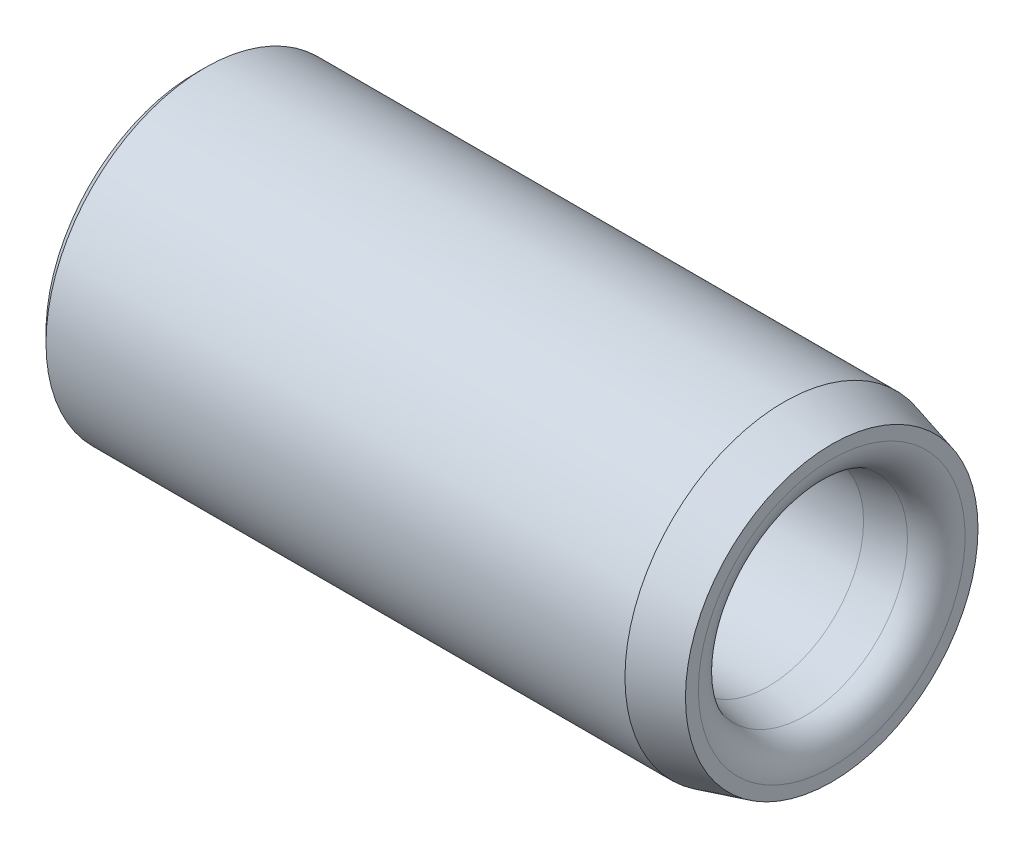
ISO-10303-21;
HEADER;
FILE_DESCRIPTION(('STEP AP214'),'2;1');
FILE_NAME('part.step','',(''),(''),'','','');
FILE_SCHEMA(('AUTOMOTIVE_DESIGN { 1 0 10303 214 1 1 1 1 }'));
ENDSEC;
DATA;
#1=APPLICATION_CONTEXT('core data for automotive mechanical design processes');
#2=APPLICATION_PROTOCOL_DEFINITION('international standard','automotive_design',2000,#1);
#3=PRODUCT_CONTEXT('',#1,'mechanical');
#4=PRODUCT('Part','Part','',(#3));
#5=PRODUCT_RELATED_PRODUCT_CATEGORY('part','',(#4));
#6=PRODUCT_DEFINITION_FORMATION('','',#4);
#7=PRODUCT_DEFINITION_CONTEXT('part definition',#1,'design');
#8=PRODUCT_DEFINITION('design','',#6,#7);
#9=PRODUCT_DEFINITION_SHAPE('','',#8);
#10=(LENGTH_UNIT() NAMED_UNIT(*) SI_UNIT(.MILLI.,.METRE.));
#11=(NAMED_UNIT(*) PLANE_ANGLE_UNIT() SI_UNIT($,.RADIAN.));
#12=(NAMED_UNIT(*) SI_UNIT($,.STERADIAN.) SOLID_ANGLE_UNIT());
#13=UNCERTAINTY_MEASURE_WITH_UNIT(LENGTH_MEASURE(1.E-05),#10,'distance_accuracy_value','');
#14=(GEOMETRIC_REPRESENTATION_CONTEXT(3) GLOBAL_UNCERTAINTY_ASSIGNED_CONTEXT((#13)) GLOBAL_UNIT_ASSIGNED_CONTEXT((#10,
#11,#12)) REPRESENTATION_CONTEXT('',''));
#15=CARTESIAN_POINT('',(0.,0.,0.));
#16=DIRECTION('',(0.,0.,1.));
#17=DIRECTION('',(1.,0.,0.));
#18=AXIS2_PLACEMENT_3D('',#15,#16,#17);
#19=CARTESIAN_POINT('',(0.,0.,0.));
#20=DIRECTION('',(-1.,0.,0.));
#21=DIRECTION('',(0.,0.,1.));
#22=AXIS2_PLACEMENT_3D('',#19,#20,#21);
#23=CYLINDRICAL_SURFACE('',#22,3.);
#24=CARTESIAN_POINT('',(17.9999999999999,0.,0.));
#25=DIRECTION('',(-1.,0.,0.));
#26=DIRECTION('',(0.,0.,1.));
#27=AXIS2_PLACEMENT_3D('',#24,#25,#26);
#28=CIRCLE('',#27,3.);
#29=CARTESIAN_POINT('',(17.9999999999999,0.,3.));
#30=VERTEX_POINT('',#29);
#31=EDGE_CURVE('E61',#30,#30,#28,.F.);
#32=ORIENTED_EDGE('',*,*,#31,.T.);
#33=EDGE_LOOP('',(#32));
#34=FACE_BOUND('',#33,.T.);
#35=CARTESIAN_POINT('',(2.00000000000002,0.,0.));
#36=DIRECTION('',(1.,0.,0.));
#37=DIRECTION('',(0.,0.,-1.));
#38=AXIS2_PLACEMENT_3D('',#35,#36,#37);
#39=CIRCLE('',#38,3.);
#40=CARTESIAN_POINT('',(2.00000000000002,0.,-3.));
#41=VERTEX_POINT('',#40);
#42=EDGE_CURVE('E65',#41,#41,#39,.F.);
#43=ORIENTED_EDGE('',*,*,#42,.T.);
#44=EDGE_LOOP('',(#43));
#45=FACE_BOUND('',#44,.T.);
#46=ADVANCED_FACE('F39',(#34,#45),#23,.F.);
#47=CARTESIAN_POINT('',(0.,3.,0.));
#48=DIRECTION('',(1.,0.,0.));
#49=DIRECTION('',(0.,0.,-1.));
#50=AXIS2_PLACEMENT_3D('',#47,#48,#49);
#51=PLANE('',#50);
#52=CARTESIAN_POINT('',(0.,0.,0.));
#53=DIRECTION('',(1.,0.,0.));
#54=DIRECTION('',(0.,0.,-1.));
#55=AXIS2_PLACEMENT_3D('',#52,#53,#54);
#56=CIRCLE('',#55,4.19175359259421);
#57=CARTESIAN_POINT('',(0.,0.,-4.19175359259421));
#58=VERTEX_POINT('',#57);
#59=EDGE_CURVE('E55',#58,#58,#56,.T.);
#60=ORIENTED_EDGE('',*,*,#59,.T.);
#61=EDGE_LOOP('',(#60));
#62=FACE_BOUND('',#61,.T.);
#63=CARTESIAN_POINT('',(0.,0.,0.));
#64=DIRECTION('',(1.,0.,0.));
#65=DIRECTION('',(0.,0.,-1.));
#66=AXIS2_PLACEMENT_3D('',#63,#64,#65);
#67=CIRCLE('',#66,4.7);
#68=CARTESIAN_POINT('',(0.,0.,-4.7));
#69=VERTEX_POINT('',#68);
#70=EDGE_CURVE('E80',#69,#69,#67,.F.);
#71=ORIENTED_EDGE('',*,*,#70,.T.);
#72=EDGE_LOOP('',(#71));
#73=FACE_BOUND('',#72,.T.);
#74=ADVANCED_FACE('F85',(#62,#73),#51,.F.);
#75=CARTESIAN_POINT('',(0.,0.,0.));
#76=DIRECTION('',(-1.,0.,0.));
#77=DIRECTION('',(0.,0.,1.));
#78=AXIS2_PLACEMENT_3D('',#75,#76,#77);
#79=CYLINDRICAL_SURFACE('',#78,5.);
#80=CARTESIAN_POINT('',(18.5,0.,0.));
#81=DIRECTION('',(-1.,0.,0.));
#82=DIRECTION('',(0.,0.,1.));
#83=AXIS2_PLACEMENT_3D('',#80,#81,#82);
#84=CIRCLE('',#83,5.);
#85=CARTESIAN_POINT('',(18.5,0.,5.));
#86=VERTEX_POINT('',#85);
#87=EDGE_CURVE('E72',#86,#86,#84,.T.);
#88=ORIENTED_EDGE('',*,*,#87,.T.);
#89=EDGE_LOOP('',(#88));
#90=FACE_BOUND('',#89,.T.);
#91=CARTESIAN_POINT('',(0.300000000000001,0.,0.));
#92=DIRECTION('',(1.,0.,0.));
#93=DIRECTION('',(0.,0.,-1.));
#94=AXIS2_PLACEMENT_3D('',#91,#92,#93);
#95=CIRCLE('',#94,5.);
#96=CARTESIAN_POINT('',(0.300000000000001,0.,-5.));
#97=VERTEX_POINT('',#96);
#98=EDGE_CURVE('E76',#97,#97,#95,.T.);
#99=ORIENTED_EDGE('',*,*,#98,.T.);
#100=EDGE_LOOP('',(#99));
#101=FACE_BOUND('',#100,.T.);
#102=ADVANCED_FACE('F100',(#90,#101),#79,.T.);
#103=CARTESIAN_POINT('',(20.,5.,0.));
#104=DIRECTION('',(-1.,0.,0.));
#105=DIRECTION('',(0.,0.,1.));
#106=AXIS2_PLACEMENT_3D('',#103,#104,#105);
#107=PLANE('',#106);
#108=CARTESIAN_POINT('',(20.,0.,0.));
#109=DIRECTION('',(-1.,0.,0.));
#110=DIRECTION('',(0.,0.,1.));
#111=AXIS2_PLACEMENT_3D('',#108,#109,#110);
#112=CIRCLE('',#111,4.19175359259422);
#113=CARTESIAN_POINT('',(20.,0.,4.19175359259422));
#114=VERTEX_POINT('',#113);
#115=EDGE_CURVE('E46',#114,#114,#112,.T.);
#116=ORIENTED_EDGE('',*,*,#115,.T.);
#117=EDGE_LOOP('',(#116));
#118=FACE_BOUND('',#117,.T.);
#119=CARTESIAN_POINT('',(20.,0.,0.));
#120=DIRECTION('',(-1.,0.,0.));
#121=DIRECTION('',(0.,0.,1.));
#122=AXIS2_PLACEMENT_3D('',#119,#120,#121);
#123=CIRCLE('',#122,4.59807621135331);
#124=CARTESIAN_POINT('',(20.,0.,4.59807621135331));
#125=VERTEX_POINT('',#124);
#126=EDGE_CURVE('E69',#125,#125,#123,.F.);
#127=ORIENTED_EDGE('',*,*,#126,.T.);
#128=EDGE_LOOP('',(#127));
#129=FACE_BOUND('',#128,.T.);
#130=ADVANCED_FACE('F90',(#118,#129),#107,.F.);
#131=CARTESIAN_POINT('',(0.,0.,0.));
#132=DIRECTION('',(1.,0.,0.));
#133=DIRECTION('',(0.,0.,-1.));
#134=AXIS2_PLACEMENT_3D('',#131,#132,#133);
#135=CONICAL_SURFACE('',#134,4.7,0.785398163397448);
#136=CARTESIAN_POINT('',(0.300000000000001,0.,-5.));
#137=CARTESIAN_POINT('',(0.296875000000001,0.,-4.996875));
#138=CARTESIAN_POINT('',(0.293750000000001,0.,-4.99375));
#139=CARTESIAN_POINT('',(0.287500000000001,0.,-4.9875));
#140=CARTESIAN_POINT('',(0.284375000000001,0.,-4.984375));
#141=CARTESIAN_POINT('',(0.278125000000001,0.,-4.978125));
#142=CARTESIAN_POINT('',(0.275000000000001,0.,-4.975));
#143=CARTESIAN_POINT('',(0.268750000000001,0.,-4.96875));
#144=CARTESIAN_POINT('',(0.265625000000001,0.,-4.965625));
#145=CARTESIAN_POINT('',(0.259375000000001,0.,-4.959375));
#146=CARTESIAN_POINT('',(0.256250000000001,0.,-4.95625));
#147=CARTESIAN_POINT('',(0.250000000000001,0.,-4.95));
#148=CARTESIAN_POINT('',(0.246875000000001,0.,-4.946875));
#149=CARTESIAN_POINT('',(0.240625000000001,0.,-4.940625));
#150=CARTESIAN_POINT('',(0.237500000000001,0.,-4.9375));
#151=CARTESIAN_POINT('',(0.231250000000001,0.,-4.93125));
#152=CARTESIAN_POINT('',(0.228125000000001,0.,-4.928125));
#153=CARTESIAN_POINT('',(0.221875000000001,0.,-4.921875));
#154=CARTESIAN_POINT('',(0.218750000000001,0.,-4.91875));
#155=CARTESIAN_POINT('',(0.212500000000001,0.,-4.9125));
#156=CARTESIAN_POINT('',(0.209375000000001,0.,-4.909375));
#157=CARTESIAN_POINT('',(0.203125000000001,0.,-4.903125));
#158=CARTESIAN_POINT('',(0.200000000000001,0.,-4.9));
#159=CARTESIAN_POINT('',(0.193750000000001,0.,-4.89375));
#160=CARTESIAN_POINT('',(0.190625000000001,0.,-4.890625));
#161=CARTESIAN_POINT('',(0.184375000000001,0.,-4.884375));
#162=CARTESIAN_POINT('',(0.181250000000001,0.,-4.88125));
#163=CARTESIAN_POINT('',(0.175,0.,-4.875));
#164=CARTESIAN_POINT('',(0.171875,0.,-4.871875));
#165=CARTESIAN_POINT('',(0.165625,0.,-4.865625));
#166=CARTESIAN_POINT('',(0.1625,0.,-4.8625));
#167=CARTESIAN_POINT('',(0.15625,0.,-4.85625));
#168=CARTESIAN_POINT('',(0.153125,0.,-4.853125));
#169=CARTESIAN_POINT('',(0.146875,0.,-4.846875));
#170=CARTESIAN_POINT('',(0.14375,0.,-4.84375));
#171=CARTESIAN_POINT('',(0.1375,0.,-4.8375));
#172=CARTESIAN_POINT('',(0.134375,0.,-4.834375));
#173=CARTESIAN_POINT('',(0.128125,0.,-4.828125));
#174=CARTESIAN_POINT('',(0.125,0.,-4.825));
#175=CARTESIAN_POINT('',(0.11875,0.,-4.81875));
#176=CARTESIAN_POINT('',(0.115625,0.,-4.815625));
#177=CARTESIAN_POINT('',(0.109375,0.,-4.809375));
#178=CARTESIAN_POINT('',(0.10625,0.,-4.80625));
#179=CARTESIAN_POINT('',(0.1,0.,-4.8));
#180=CARTESIAN_POINT('',(0.0968750000000003,0.,-4.796875));
#181=CARTESIAN_POINT('',(0.0906250000000002,0.,-4.790625));
#182=CARTESIAN_POINT('',(0.0875000000000002,0.,-4.7875));
#183=CARTESIAN_POINT('',(0.0812500000000002,0.,-4.78125));
#184=CARTESIAN_POINT('',(0.0781250000000002,0.,-4.778125));
#185=CARTESIAN_POINT('',(0.0718750000000002,0.,-4.771875));
#186=CARTESIAN_POINT('',(0.0687500000000001,0.,-4.76875));
#187=CARTESIAN_POINT('',(0.0625000000000001,0.,-4.7625));
#188=CARTESIAN_POINT('',(0.0593750000000002,0.,-4.759375));
#189=CARTESIAN_POINT('',(0.0531250000000002,0.,-4.753125));
#190=CARTESIAN_POINT('',(0.0500000000000002,0.,-4.75));
#191=CARTESIAN_POINT('',(0.0437500000000001,0.,-4.74375));
#192=CARTESIAN_POINT('',(0.0406250000000001,0.,-4.740625));
#193=CARTESIAN_POINT('',(0.0343750000000001,0.,-4.734375));
#194=CARTESIAN_POINT('',(0.03125,0.,-4.73125));
#195=CARTESIAN_POINT('',(0.025,0.,-4.725));
#196=CARTESIAN_POINT('',(0.0218750000000001,0.,-4.721875));
#197=CARTESIAN_POINT('',(0.0156250000000001,0.,-4.715625));
#198=CARTESIAN_POINT('',(0.0125000000000001,0.,-4.7125));
#199=CARTESIAN_POINT('',(0.00625,0.,-4.70625));
#200=CARTESIAN_POINT('',(0.00312499999999994,0.,-4.703125));
#201=CARTESIAN_POINT('',(0.,0.,-4.7));
#202=B_SPLINE_CURVE_WITH_KNOTS('',3,(#136,#137,#138,#139,#140,#141,#142,#143,#144,#145,#146,
#147,#148,#149,#150,#151,#152,#153,#154,#155,#156,#157,#158,#159,#160,#161,#162,#163,#164,#165,
#166,#167,#168,#169,#170,#171,#172,#173,#174,#175,#176,#177,#178,#179,#180,#181,#182,#183,#184,
#185,#186,#187,#188,#189,#190,#191,#192,#193,#194,#195,#196,#197,#198,#199,#200,#201),
.UNSPECIFIED.,.F.,.F.,(4,2,2,2,2,2,2,2,2,2,2,2,2,2,2,2,2,2,2,2,2,2,2,2,2,2,2,2,2,2,2,2,4),(0.,
0.0132582521472477,0.0265165042944953,0.0397747564417436,0.0530330085889913,0.066291260736239,
0.0795495128834866,0.0928077650307343,0.106066017177983,0.11932426932523,0.132582521472478,
0.145840773619726,0.159099025766974,0.172357277914222,0.185615530061469,0.198873782208717,
0.212132034355965,0.225390286503213,0.23864853865046,0.251906790797708,0.265165042944956,
0.278423295092204,0.291681547239452,0.304939799386699,0.318198051533947,0.331456303681195,
0.344714555828443,0.357972807975691,0.371231060122938,0.384489312270186,0.397747564417434,
0.411005816564682,0.42426406871193),.UNSPECIFIED.);
#203=EDGE_CURVE('BSEAM87',#97,#69,#202,.T.);
#204=ORIENTED_EDGE('',*,*,#98,.F.);
#205=ORIENTED_EDGE('',*,*,#70,.F.);
#206=ORIENTED_EDGE('',*,*,#203,.T.);
#207=ORIENTED_EDGE('',*,*,#203,.F.);
#208=EDGE_LOOP('',(#204,#206,#205,#207));
#209=FACE_BOUND('',#208,.T.);
#210=ADVANCED_FACE('F87',(#209),#135,.T.);
#211=CARTESIAN_POINT('',(18.5,0.,0.));
#212=DIRECTION('',(-1.,0.,0.));
#213=DIRECTION('',(0.,0.,1.));
#214=AXIS2_PLACEMENT_3D('',#211,#212,#213);
#215=CONICAL_SURFACE('',#214,5.,0.261799387799147);
#216=ORIENTED_EDGE('',*,*,#126,.F.);
#217=EDGE_LOOP('',(#216));
#218=FACE_BOUND('',#217,.T.);
#219=ORIENTED_EDGE('',*,*,#87,.F.);
#220=EDGE_LOOP('',(#219));
#221=FACE_BOUND('',#220,.T.);
#222=ADVANCED_FACE('F89',(#218,#221),#215,.T.);
#223=CARTESIAN_POINT('',(20.,0.,0.));
#224=DIRECTION('',(1.,0.,0.));
#225=DIRECTION('',(0.,0.,-1.));
#226=AXIS2_PLACEMENT_3D('',#223,#224,#225);
#227=CONICAL_SURFACE('',#226,3.35265396141693,0.17453292519943);
#228=CARTESIAN_POINT('',(19.1736481776669,0.,0.));
#229=DIRECTION('',(1.,0.,0.));
#230=DIRECTION('',(0.,0.,-1.));
#231=AXIS2_PLACEMENT_3D('',#228,#229,#230);
#232=CIRCLE('',#231,3.20694583958201);
#233=CARTESIAN_POINT('',(19.1736481776669,0.,-3.20694583958201));
#234=VERTEX_POINT('',#233);
#235=EDGE_CURVE('E10',#234,#234,#232,.T.);
#236=ORIENTED_EDGE('',*,*,#235,.T.);
#237=EDGE_LOOP('',(#236));
#238=FACE_BOUND('',#237,.T.);
#239=ORIENTED_EDGE('',*,*,#31,.F.);
#240=EDGE_LOOP('',(#239));
#241=FACE_BOUND('',#240,.T.);
#242=ADVANCED_FACE('F97',(#238,#241),#227,.F.);
#243=CARTESIAN_POINT('',(2.00000000000002,0.,0.));
#244=DIRECTION('',(-1.,0.,0.));
#245=DIRECTION('',(0.,0.,1.));
#246=AXIS2_PLACEMENT_3D('',#243,#244,#245);
#247=CONICAL_SURFACE('',#246,3.,0.17453292519943);
#248=CARTESIAN_POINT('',(0.826351822333073,0.,0.));
#249=DIRECTION('',(-1.,0.,0.));
#250=DIRECTION('',(0.,0.,1.));
#251=AXIS2_PLACEMENT_3D('',#248,#249,#250);
#252=CIRCLE('',#251,3.206945839582);
#253=CARTESIAN_POINT('',(0.826351822333073,0.,3.206945839582));
#254=VERTEX_POINT('',#253);
#255=EDGE_CURVE('E50',#254,#254,#252,.T.);
#256=ORIENTED_EDGE('',*,*,#255,.T.);
#257=EDGE_LOOP('',(#256));
#258=FACE_BOUND('',#257,.T.);
#259=ORIENTED_EDGE('',*,*,#42,.F.);
#260=EDGE_LOOP('',(#259));
#261=FACE_BOUND('',#260,.T.);
#262=ADVANCED_FACE('F139',(#258,#261),#247,.F.);
#263=CARTESIAN_POINT('',(1.,0.,0.));
#264=DIRECTION('',(1.,0.,0.));
#265=DIRECTION('',(0.,0.,-1.));
#266=AXIS2_PLACEMENT_3D('',#263,#264,#265);
#267=TOROIDAL_SURFACE('',#266,4.19175359259421,1.);
#268=ORIENTED_EDGE('',*,*,#255,.F.);
#269=EDGE_LOOP('',(#268));
#270=FACE_BOUND('',#269,.T.);
#271=ORIENTED_EDGE('',*,*,#59,.F.);
#272=EDGE_LOOP('',(#271));
#273=FACE_BOUND('',#272,.T.);
#274=ADVANCED_FACE('F149',(#270,#273),#267,.T.);
#275=CARTESIAN_POINT('',(19.,0.,0.));
#276=DIRECTION('',(-1.,0.,0.));
#277=DIRECTION('',(0.,0.,1.));
#278=AXIS2_PLACEMENT_3D('',#275,#276,#277);
#279=TOROIDAL_SURFACE('',#278,4.19175359259422,1.);
#280=ORIENTED_EDGE('',*,*,#235,.F.);
#281=EDGE_LOOP('',(#280));
#282=FACE_BOUND('',#281,.T.);
#283=ORIENTED_EDGE('',*,*,#115,.F.);
#284=EDGE_LOOP('',(#283));
#285=FACE_BOUND('',#284,.T.);
#286=ADVANCED_FACE('F41',(#282,#285),#279,.T.);
#287=CLOSED_SHELL('',(#46,#74,#102,#130,#210,#222,#242,#262,#274,#286));
#288=MANIFOLD_SOLID_BREP('B2',#287);
#289=ADVANCED_BREP_SHAPE_REPRESENTATION('',(#18,#288),#14);
#290=SHAPE_DEFINITION_REPRESENTATION(#9,#289);
ENDSEC;
END-ISO-10303-21;
